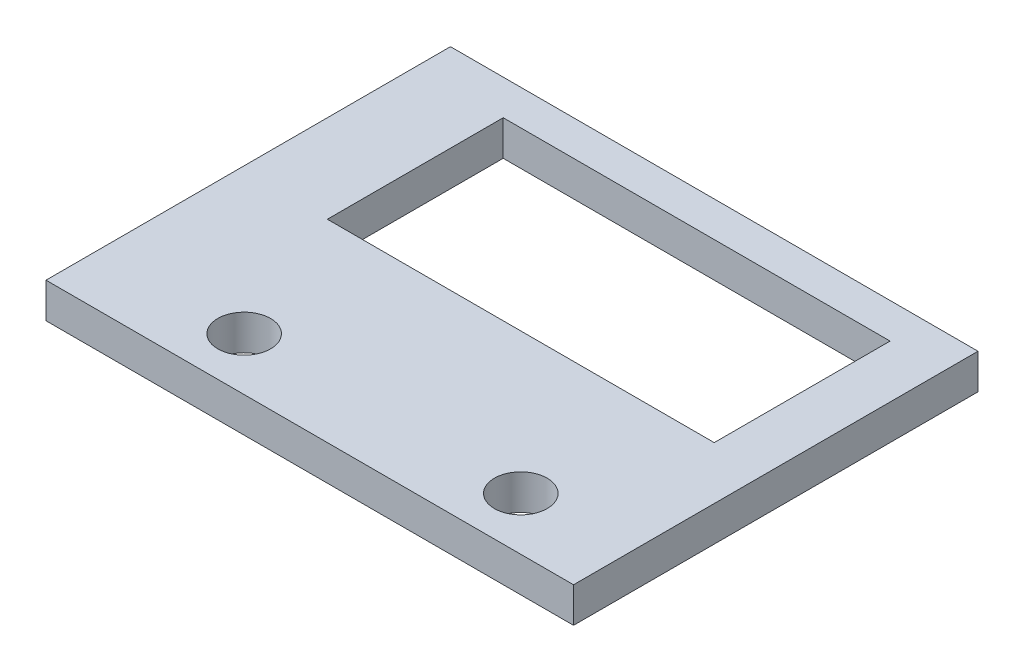
ISO-10303-21;
HEADER;
FILE_DESCRIPTION(('STEP AP214'),'2;1');
FILE_NAME('part.step','',(''),(''),'','','');
FILE_SCHEMA(('AUTOMOTIVE_DESIGN { 1 0 10303 214 1 1 1 1 }'));
ENDSEC;
DATA;
#1=APPLICATION_CONTEXT('core data for automotive mechanical design processes');
#2=APPLICATION_PROTOCOL_DEFINITION('international standard','automotive_design',2000,#1);
#3=PRODUCT_CONTEXT('',#1,'mechanical');
#4=PRODUCT('Part','Part','',(#3));
#5=PRODUCT_RELATED_PRODUCT_CATEGORY('part','',(#4));
#6=PRODUCT_DEFINITION_FORMATION('','',#4);
#7=PRODUCT_DEFINITION_CONTEXT('part definition',#1,'design');
#8=PRODUCT_DEFINITION('design','',#6,#7);
#9=PRODUCT_DEFINITION_SHAPE('','',#8);
#10=(LENGTH_UNIT() NAMED_UNIT(*) SI_UNIT(.MILLI.,.METRE.));
#11=(NAMED_UNIT(*) PLANE_ANGLE_UNIT() SI_UNIT($,.RADIAN.));
#12=(NAMED_UNIT(*) SI_UNIT($,.STERADIAN.) SOLID_ANGLE_UNIT());
#13=UNCERTAINTY_MEASURE_WITH_UNIT(LENGTH_MEASURE(1.E-05),#10,'distance_accuracy_value','');
#14=(GEOMETRIC_REPRESENTATION_CONTEXT(3) GLOBAL_UNCERTAINTY_ASSIGNED_CONTEXT((#13)) GLOBAL_UNIT_ASSIGNED_CONTEXT((#10,
#11,#12)) REPRESENTATION_CONTEXT('',''));
#15=CARTESIAN_POINT('',(0.,0.,0.));
#16=DIRECTION('',(0.,0.,1.));
#17=DIRECTION('',(1.,0.,0.));
#18=AXIS2_PLACEMENT_3D('',#15,#16,#17);
#19=CARTESIAN_POINT('',(-15.,2.,11.5));
#20=DIRECTION('',(1.,0.,0.));
#21=DIRECTION('',(0.,0.,-1.));
#22=AXIS2_PLACEMENT_3D('',#19,#20,#21);
#23=PLANE('',#22);
#24=DIRECTION('',(0.,0.,1.));
#25=VECTOR('',#24,1.);
#26=CARTESIAN_POINT('',(-15.,0.,11.5));
#27=LINE('',#26,#25);
#28=CARTESIAN_POINT('',(-15.,0.,-11.5));
#29=VERTEX_POINT('',#28);
#30=CARTESIAN_POINT('',(-15.,0.,11.5));
#31=VERTEX_POINT('',#30);
#32=EDGE_CURVE('E142',#29,#31,#27,.T.);
#33=ORIENTED_EDGE('',*,*,#32,.T.);
#34=DIRECTION('',(0.,-1.,0.));
#35=VECTOR('',#34,1.);
#36=CARTESIAN_POINT('',(-15.,2.,11.5));
#37=LINE('',#36,#35);
#38=CARTESIAN_POINT('',(-15.,2.,11.5));
#39=VERTEX_POINT('',#38);
#40=EDGE_CURVE('E159',#39,#31,#37,.T.);
#41=ORIENTED_EDGE('',*,*,#40,.F.);
#42=DIRECTION('',(0.,0.,1.));
#43=VECTOR('',#42,1.);
#44=CARTESIAN_POINT('',(-15.,2.,11.5));
#45=LINE('',#44,#43);
#46=CARTESIAN_POINT('',(-15.,2.,-11.5));
#47=VERTEX_POINT('',#46);
#48=EDGE_CURVE('E131',#47,#39,#45,.T.);
#49=ORIENTED_EDGE('',*,*,#48,.F.);
#50=DIRECTION('',(0.,-1.,0.));
#51=VECTOR('',#50,1.);
#52=CARTESIAN_POINT('',(-15.,2.,-11.5));
#53=LINE('',#52,#51);
#54=EDGE_CURVE('E141',#47,#29,#53,.T.);
#55=ORIENTED_EDGE('',*,*,#54,.T.);
#56=EDGE_LOOP('',(#33,#41,#49,#55));
#57=FACE_BOUND('',#56,.T.);
#58=ADVANCED_FACE('F34',(#57),#23,.F.);
#59=CARTESIAN_POINT('',(15.,2.,11.5));
#60=DIRECTION('',(0.,0.,-1.));
#61=DIRECTION('',(-1.,0.,0.));
#62=AXIS2_PLACEMENT_3D('',#59,#60,#61);
#63=PLANE('',#62);
#64=DIRECTION('',(1.,0.,0.));
#65=VECTOR('',#64,1.);
#66=CARTESIAN_POINT('',(15.,0.,11.5));
#67=LINE('',#66,#65);
#68=CARTESIAN_POINT('',(15.,0.,11.5));
#69=VERTEX_POINT('',#68);
#70=EDGE_CURVE('E145',#31,#69,#67,.T.);
#71=ORIENTED_EDGE('',*,*,#70,.T.);
#72=DIRECTION('',(0.,-1.,0.));
#73=VECTOR('',#72,1.);
#74=CARTESIAN_POINT('',(15.,2.,11.5));
#75=LINE('',#74,#73);
#76=CARTESIAN_POINT('',(15.,2.,11.5));
#77=VERTEX_POINT('',#76);
#78=EDGE_CURVE('E156',#77,#69,#75,.T.);
#79=ORIENTED_EDGE('',*,*,#78,.F.);
#80=DIRECTION('',(1.,0.,0.));
#81=VECTOR('',#80,1.);
#82=CARTESIAN_POINT('',(15.,2.,11.5));
#83=LINE('',#82,#81);
#84=EDGE_CURVE('E134',#39,#77,#83,.T.);
#85=ORIENTED_EDGE('',*,*,#84,.F.);
#86=ORIENTED_EDGE('',*,*,#40,.T.);
#87=EDGE_LOOP('',(#71,#79,#85,#86));
#88=FACE_BOUND('',#87,.T.);
#89=ADVANCED_FACE('F190',(#88),#63,.F.);
#90=CARTESIAN_POINT('',(15.,2.,11.5));
#91=DIRECTION('',(-1.,0.,0.));
#92=DIRECTION('',(0.,0.,1.));
#93=AXIS2_PLACEMENT_3D('',#90,#91,#92);
#94=PLANE('',#93);
#95=DIRECTION('',(0.,0.,-1.));
#96=VECTOR('',#95,1.);
#97=CARTESIAN_POINT('',(15.,0.,11.5));
#98=LINE('',#97,#96);
#99=CARTESIAN_POINT('',(15.,0.,-11.5));
#100=VERTEX_POINT('',#99);
#101=EDGE_CURVE('E148',#69,#100,#98,.T.);
#102=ORIENTED_EDGE('',*,*,#101,.T.);
#103=DIRECTION('',(0.,-1.,0.));
#104=VECTOR('',#103,1.);
#105=CARTESIAN_POINT('',(15.,2.,-11.5));
#106=LINE('',#105,#104);
#107=CARTESIAN_POINT('',(15.,2.,-11.5));
#108=VERTEX_POINT('',#107);
#109=EDGE_CURVE('E153',#108,#100,#106,.T.);
#110=ORIENTED_EDGE('',*,*,#109,.F.);
#111=DIRECTION('',(0.,0.,-1.));
#112=VECTOR('',#111,1.);
#113=CARTESIAN_POINT('',(15.,2.,11.5));
#114=LINE('',#113,#112);
#115=EDGE_CURVE('E137',#77,#108,#114,.T.);
#116=ORIENTED_EDGE('',*,*,#115,.F.);
#117=ORIENTED_EDGE('',*,*,#78,.T.);
#118=EDGE_LOOP('',(#102,#110,#116,#117));
#119=FACE_BOUND('',#118,.T.);
#120=ADVANCED_FACE('F195',(#119),#94,.F.);
#121=CARTESIAN_POINT('',(15.,2.,-11.5));
#122=DIRECTION('',(0.,0.,1.));
#123=DIRECTION('',(1.,0.,0.));
#124=AXIS2_PLACEMENT_3D('',#121,#122,#123);
#125=PLANE('',#124);
#126=DIRECTION('',(-1.,0.,0.));
#127=VECTOR('',#126,1.);
#128=CARTESIAN_POINT('',(15.,0.,-11.5));
#129=LINE('',#128,#127);
#130=EDGE_CURVE('E135',#100,#29,#129,.T.);
#131=ORIENTED_EDGE('',*,*,#130,.T.);
#132=ORIENTED_EDGE('',*,*,#54,.F.);
#133=DIRECTION('',(-1.,0.,0.));
#134=VECTOR('',#133,1.);
#135=CARTESIAN_POINT('',(15.,2.,-11.5));
#136=LINE('',#135,#134);
#137=EDGE_CURVE('E139',#108,#47,#136,.T.);
#138=ORIENTED_EDGE('',*,*,#137,.F.);
#139=ORIENTED_EDGE('',*,*,#109,.T.);
#140=EDGE_LOOP('',(#131,#132,#138,#139));
#141=FACE_BOUND('',#140,.T.);
#142=ADVANCED_FACE('F210',(#141),#125,.F.);
#143=CARTESIAN_POINT('',(0.,2.,0.));
#144=DIRECTION('',(0.,1.,0.));
#145=DIRECTION('',(0.,0.,1.));
#146=AXIS2_PLACEMENT_3D('',#143,#144,#145);
#147=PLANE('',#146);
#148=DIRECTION('',(0.,0.,1.));
#149=VECTOR('',#148,1.);
#150=CARTESIAN_POINT('',(-10.,2.,0.500000000000007));
#151=LINE('',#150,#149);
#152=CARTESIAN_POINT('',(-10.,2.,-9.49999999999999));
#153=VERTEX_POINT('',#152);
#154=CARTESIAN_POINT('',(-10.,2.,0.500000000000007));
#155=VERTEX_POINT('',#154);
#156=EDGE_CURVE('E48',#153,#155,#151,.T.);
#157=ORIENTED_EDGE('',*,*,#156,.F.);
#158=DIRECTION('',(-1.,0.,0.));
#159=VECTOR('',#158,1.);
#160=CARTESIAN_POINT('',(12.,2.,-9.5));
#161=LINE('',#160,#159);
#162=CARTESIAN_POINT('',(12.,2.,-9.5));
#163=VERTEX_POINT('',#162);
#164=EDGE_CURVE('E117',#163,#153,#161,.T.);
#165=ORIENTED_EDGE('',*,*,#164,.F.);
#166=DIRECTION('',(0.,0.,-1.));
#167=VECTOR('',#166,1.);
#168=CARTESIAN_POINT('',(12.,2.,0.500000000000004));
#169=LINE('',#168,#167);
#170=CARTESIAN_POINT('',(12.,2.,0.500000000000004));
#171=VERTEX_POINT('',#170);
#172=EDGE_CURVE('E101',#171,#163,#169,.T.);
#173=ORIENTED_EDGE('',*,*,#172,.F.);
#174=DIRECTION('',(1.,0.,0.));
#175=VECTOR('',#174,1.);
#176=CARTESIAN_POINT('',(12.,2.,0.500000000000004));
#177=LINE('',#176,#175);
#178=EDGE_CURVE('E110',#155,#171,#177,.T.);
#179=ORIENTED_EDGE('',*,*,#178,.F.);
#180=EDGE_LOOP('',(#157,#165,#173,#179));
#181=FACE_BOUND('',#180,.T.);
#182=CARTESIAN_POINT('',(9.,2.,8.5));
#183=DIRECTION('',(0.,1.,0.));
#184=DIRECTION('',(0.,0.,1.));
#185=AXIS2_PLACEMENT_3D('',#182,#183,#184);
#186=CIRCLE('',#185,1.5);
#187=CARTESIAN_POINT('',(9.,2.,10.));
#188=VERTEX_POINT('',#187);
#189=EDGE_CURVE('E124',#188,#188,#186,.T.);
#190=ORIENTED_EDGE('',*,*,#189,.F.);
#191=EDGE_LOOP('',(#190));
#192=FACE_BOUND('',#191,.T.);
#193=CARTESIAN_POINT('',(-6.73,2.,8.5));
#194=DIRECTION('',(0.,1.,0.));
#195=DIRECTION('',(0.,0.,1.));
#196=AXIS2_PLACEMENT_3D('',#193,#194,#195);
#197=CIRCLE('',#196,1.5);
#198=CARTESIAN_POINT('',(-6.73,2.,10.));
#199=VERTEX_POINT('',#198);
#200=EDGE_CURVE('E127',#199,#199,#197,.T.);
#201=ORIENTED_EDGE('',*,*,#200,.F.);
#202=EDGE_LOOP('',(#201));
#203=FACE_BOUND('',#202,.T.);
#204=ORIENTED_EDGE('',*,*,#48,.T.);
#205=ORIENTED_EDGE('',*,*,#84,.T.);
#206=ORIENTED_EDGE('',*,*,#115,.T.);
#207=ORIENTED_EDGE('',*,*,#137,.T.);
#208=EDGE_LOOP('',(#204,#205,#206,#207));
#209=FACE_BOUND('',#208,.T.);
#210=ADVANCED_FACE('F114',(#181,#192,#203,#209),#147,.T.);
#211=CARTESIAN_POINT('',(0.,0.,0.));
#212=DIRECTION('',(0.,1.,0.));
#213=DIRECTION('',(0.,0.,1.));
#214=AXIS2_PLACEMENT_3D('',#211,#212,#213);
#215=PLANE('',#214);
#216=DIRECTION('',(-1.,0.,0.));
#217=VECTOR('',#216,1.);
#218=CARTESIAN_POINT('',(0.,0.,-9.49999999999999));
#219=LINE('',#218,#217);
#220=CARTESIAN_POINT('',(12.,0.,-9.5));
#221=VERTEX_POINT('',#220);
#222=CARTESIAN_POINT('',(-10.,0.,-9.49999999999999));
#223=VERTEX_POINT('',#222);
#224=EDGE_CURVE('E41',#221,#223,#219,.T.);
#225=ORIENTED_EDGE('',*,*,#224,.T.);
#226=DIRECTION('',(0.,0.,1.));
#227=VECTOR('',#226,1.);
#228=CARTESIAN_POINT('',(-10.,0.,0.));
#229=LINE('',#228,#227);
#230=CARTESIAN_POINT('',(-10.,0.,0.500000000000007));
#231=VERTEX_POINT('',#230);
#232=EDGE_CURVE('E11',#223,#231,#229,.T.);
#233=ORIENTED_EDGE('',*,*,#232,.T.);
#234=DIRECTION('',(1.,0.,0.));
#235=VECTOR('',#234,1.);
#236=CARTESIAN_POINT('',(0.,0.,0.500000000000005));
#237=LINE('',#236,#235);
#238=CARTESIAN_POINT('',(12.,0.,0.500000000000004));
#239=VERTEX_POINT('',#238);
#240=EDGE_CURVE('E162',#231,#239,#237,.T.);
#241=ORIENTED_EDGE('',*,*,#240,.T.);
#242=DIRECTION('',(0.,0.,-1.));
#243=VECTOR('',#242,1.);
#244=CARTESIAN_POINT('',(12.,0.,0.));
#245=LINE('',#244,#243);
#246=EDGE_CURVE('E104',#239,#221,#245,.T.);
#247=ORIENTED_EDGE('',*,*,#246,.T.);
#248=EDGE_LOOP('',(#225,#233,#241,#247));
#249=FACE_BOUND('',#248,.T.);
#250=CARTESIAN_POINT('',(9.,0.,8.5));
#251=DIRECTION('',(0.,1.,0.));
#252=DIRECTION('',(0.,0.,1.));
#253=AXIS2_PLACEMENT_3D('',#250,#251,#252);
#254=CIRCLE('',#253,1.5);
#255=CARTESIAN_POINT('',(9.,0.,10.));
#256=VERTEX_POINT('',#255);
#257=EDGE_CURVE('E146',#256,#256,#254,.T.);
#258=ORIENTED_EDGE('',*,*,#257,.T.);
#259=EDGE_LOOP('',(#258));
#260=FACE_BOUND('',#259,.T.);
#261=CARTESIAN_POINT('',(-6.73,0.,8.5));
#262=DIRECTION('',(0.,1.,0.));
#263=DIRECTION('',(0.,0.,1.));
#264=AXIS2_PLACEMENT_3D('',#261,#262,#263);
#265=CIRCLE('',#264,1.5);
#266=CARTESIAN_POINT('',(-6.73,0.,10.));
#267=VERTEX_POINT('',#266);
#268=EDGE_CURVE('E130',#267,#267,#265,.T.);
#269=ORIENTED_EDGE('',*,*,#268,.T.);
#270=EDGE_LOOP('',(#269));
#271=FACE_BOUND('',#270,.T.);
#272=ORIENTED_EDGE('',*,*,#32,.F.);
#273=ORIENTED_EDGE('',*,*,#130,.F.);
#274=ORIENTED_EDGE('',*,*,#101,.F.);
#275=ORIENTED_EDGE('',*,*,#70,.F.);
#276=EDGE_LOOP('',(#272,#273,#274,#275));
#277=FACE_BOUND('',#276,.T.);
#278=ADVANCED_FACE('F170',(#249,#260,#271,#277),#215,.F.);
#279=CARTESIAN_POINT('',(-6.73,-1.,8.5));
#280=DIRECTION('',(0.,1.,0.));
#281=DIRECTION('',(0.,0.,1.));
#282=AXIS2_PLACEMENT_3D('',#279,#280,#281);
#283=CYLINDRICAL_SURFACE('',#282,1.5);
#284=ORIENTED_EDGE('',*,*,#200,.T.);
#285=EDGE_LOOP('',(#284));
#286=FACE_BOUND('',#285,.T.);
#287=ORIENTED_EDGE('',*,*,#268,.F.);
#288=EDGE_LOOP('',(#287));
#289=FACE_BOUND('',#288,.T.);
#290=ADVANCED_FACE('F184',(#286,#289),#283,.F.);
#291=CARTESIAN_POINT('',(9.,-1.,8.5));
#292=DIRECTION('',(0.,1.,0.));
#293=DIRECTION('',(0.,0.,1.));
#294=AXIS2_PLACEMENT_3D('',#291,#292,#293);
#295=CYLINDRICAL_SURFACE('',#294,1.5);
#296=ORIENTED_EDGE('',*,*,#189,.T.);
#297=EDGE_LOOP('',(#296));
#298=FACE_BOUND('',#297,.T.);
#299=ORIENTED_EDGE('',*,*,#257,.F.);
#300=EDGE_LOOP('',(#299));
#301=FACE_BOUND('',#300,.T.);
#302=ADVANCED_FACE('F177',(#298,#301),#295,.F.);
#303=CARTESIAN_POINT('',(-10.,-1.,0.500000000000007));
#304=DIRECTION('',(-1.,0.,0.));
#305=DIRECTION('',(0.,0.,1.));
#306=AXIS2_PLACEMENT_3D('',#303,#304,#305);
#307=PLANE('',#306);
#308=DIRECTION('',(0.,1.,0.));
#309=VECTOR('',#308,1.);
#310=CARTESIAN_POINT('',(-10.,-1.,-9.49999999999999));
#311=LINE('',#310,#309);
#312=EDGE_CURVE('E122',#223,#153,#311,.T.);
#313=ORIENTED_EDGE('',*,*,#312,.T.);
#314=ORIENTED_EDGE('',*,*,#156,.T.);
#315=DIRECTION('',(0.,1.,0.));
#316=VECTOR('',#315,1.);
#317=CARTESIAN_POINT('',(-10.,-1.,0.500000000000007));
#318=LINE('',#317,#316);
#319=EDGE_CURVE('E107',#231,#155,#318,.T.);
#320=ORIENTED_EDGE('',*,*,#319,.F.);
#321=ORIENTED_EDGE('',*,*,#232,.F.);
#322=EDGE_LOOP('',(#313,#314,#320,#321));
#323=FACE_BOUND('',#322,.T.);
#324=ADVANCED_FACE('F175',(#323),#307,.F.);
#325=CARTESIAN_POINT('',(12.,-1.,-9.5));
#326=DIRECTION('',(0.,0.,-1.));
#327=DIRECTION('',(-1.,0.,0.));
#328=AXIS2_PLACEMENT_3D('',#325,#326,#327);
#329=PLANE('',#328);
#330=DIRECTION('',(0.,1.,0.));
#331=VECTOR('',#330,1.);
#332=CARTESIAN_POINT('',(12.,-1.,-9.5));
#333=LINE('',#332,#331);
#334=EDGE_CURVE('E106',#221,#163,#333,.T.);
#335=ORIENTED_EDGE('',*,*,#334,.T.);
#336=ORIENTED_EDGE('',*,*,#164,.T.);
#337=ORIENTED_EDGE('',*,*,#312,.F.);
#338=ORIENTED_EDGE('',*,*,#224,.F.);
#339=EDGE_LOOP('',(#335,#336,#337,#338));
#340=FACE_BOUND('',#339,.T.);
#341=ADVANCED_FACE('F174',(#340),#329,.F.);
#342=CARTESIAN_POINT('',(12.,-1.,0.500000000000004));
#343=DIRECTION('',(1.,0.,0.));
#344=DIRECTION('',(0.,0.,-1.));
#345=AXIS2_PLACEMENT_3D('',#342,#343,#344);
#346=PLANE('',#345);
#347=DIRECTION('',(0.,1.,0.));
#348=VECTOR('',#347,1.);
#349=CARTESIAN_POINT('',(12.,-1.,0.500000000000004));
#350=LINE('',#349,#348);
#351=EDGE_CURVE('E56',#239,#171,#350,.T.);
#352=ORIENTED_EDGE('',*,*,#351,.T.);
#353=ORIENTED_EDGE('',*,*,#172,.T.);
#354=ORIENTED_EDGE('',*,*,#334,.F.);
#355=ORIENTED_EDGE('',*,*,#246,.F.);
#356=EDGE_LOOP('',(#352,#353,#354,#355));
#357=FACE_BOUND('',#356,.T.);
#358=ADVANCED_FACE('F98',(#357),#346,.F.);
#359=CARTESIAN_POINT('',(12.,-1.,0.500000000000004));
#360=DIRECTION('',(0.,0.,1.));
#361=DIRECTION('',(1.,0.,0.));
#362=AXIS2_PLACEMENT_3D('',#359,#360,#361);
#363=PLANE('',#362);
#364=ORIENTED_EDGE('',*,*,#319,.T.);
#365=ORIENTED_EDGE('',*,*,#178,.T.);
#366=ORIENTED_EDGE('',*,*,#351,.F.);
#367=ORIENTED_EDGE('',*,*,#240,.F.);
#368=EDGE_LOOP('',(#364,#365,#366,#367));
#369=FACE_BOUND('',#368,.T.);
#370=ADVANCED_FACE('F111',(#369),#363,.F.);
#371=CLOSED_SHELL('',(#58,#89,#120,#142,#210,#278,#290,#302,#324,#341,#358,#370));
#372=MANIFOLD_SOLID_BREP('B2',#371);
#373=ADVANCED_BREP_SHAPE_REPRESENTATION('',(#18,#372),#14);
#374=SHAPE_DEFINITION_REPRESENTATION(#9,#373);
ENDSEC;
END-ISO-10303-21;
